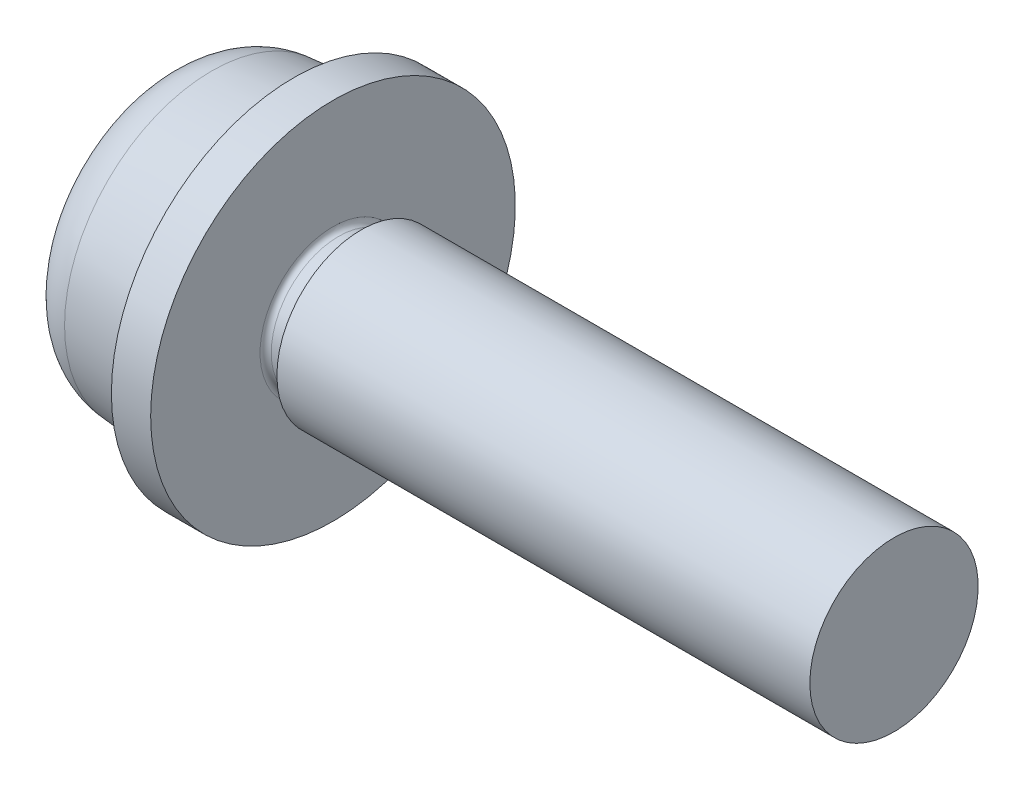
ISO-10303-21;
HEADER;
FILE_DESCRIPTION(('STEP AP214'),'2;1');
FILE_NAME('part.step','',(''),(''),'','','');
FILE_SCHEMA(('AUTOMOTIVE_DESIGN { 1 0 10303 214 1 1 1 1 }'));
ENDSEC;
DATA;
#1=APPLICATION_CONTEXT('core data for automotive mechanical design processes');
#2=APPLICATION_PROTOCOL_DEFINITION('international standard','automotive_design',2000,#1);
#3=PRODUCT_CONTEXT('',#1,'mechanical');
#4=PRODUCT('Part','Part','',(#3));
#5=PRODUCT_RELATED_PRODUCT_CATEGORY('part','',(#4));
#6=PRODUCT_DEFINITION_FORMATION('','',#4);
#7=PRODUCT_DEFINITION_CONTEXT('part definition',#1,'design');
#8=PRODUCT_DEFINITION('design','',#6,#7);
#9=PRODUCT_DEFINITION_SHAPE('','',#8);
#10=(LENGTH_UNIT() NAMED_UNIT(*) SI_UNIT(.MILLI.,.METRE.));
#11=(NAMED_UNIT(*) PLANE_ANGLE_UNIT() SI_UNIT($,.RADIAN.));
#12=(NAMED_UNIT(*) SI_UNIT($,.STERADIAN.) SOLID_ANGLE_UNIT());
#13=UNCERTAINTY_MEASURE_WITH_UNIT(LENGTH_MEASURE(1.E-05),#10,'distance_accuracy_value','');
#14=(GEOMETRIC_REPRESENTATION_CONTEXT(3) GLOBAL_UNCERTAINTY_ASSIGNED_CONTEXT((#13)) GLOBAL_UNIT_ASSIGNED_CONTEXT((#10,
#11,#12)) REPRESENTATION_CONTEXT('',''));
#15=CARTESIAN_POINT('',(0.,0.,0.));
#16=DIRECTION('',(0.,0.,1.));
#17=DIRECTION('',(1.,0.,0.));
#18=AXIS2_PLACEMENT_3D('',#15,#16,#17);
#19=CARTESIAN_POINT('',(3.7,0.,0.));
#20=DIRECTION('',(-1.,0.,0.));
#21=DIRECTION('',(0.,1.,0.));
#22=AXIS2_PLACEMENT_3D('',#19,#20,#21);
#23=SPHERICAL_SURFACE('',#22,7.);
#24=CARTESIAN_POINT('',(-3.03810877090718,0.,0.));
#25=DIRECTION('',(-1.,0.,0.));
#26=DIRECTION('',(0.,0.,1.));
#27=AXIS2_PLACEMENT_3D('',#24,#25,#26);
#28=CIRCLE('',#27,1.89681053124019);
#29=CARTESIAN_POINT('',(-3.03810877090718,0.,1.89681053124019));
#30=VERTEX_POINT('',#29);
#31=EDGE_CURVE('E168',#30,#30,#28,.T.);
#32=ORIENTED_EDGE('',*,*,#31,.T.);
#33=EDGE_LOOP('',(#32));
#34=FACE_BOUND('',#33,.T.);
#35=CARTESIAN_POINT('',(3.57699435965704,0.,0.697599651787471));
#36=DIRECTION('',(0.173648177666931,0.,-0.984807753012208));
#37=DIRECTION('',(-0.984807753012208,0.,-0.173648177666931));
#38=AXIS2_PLACEMENT_3D('',#35,#36,#37);
#39=CIRCLE('',#38,6.96406665234257);
#40=CARTESIAN_POINT('',(-3.234145616115,-0.815,-0.503388095323143));
#41=VERTEX_POINT('',#40);
#42=CARTESIAN_POINT('',(-3.04681075609609,-1.80535590507456,-0.470355905074564));
#43=VERTEX_POINT('',#42);
#44=EDGE_CURVE('E364',#41,#43,#39,.F.);
#45=ORIENTED_EDGE('',*,*,#44,.F.);
#46=CARTESIAN_POINT('',(-3.23412239886365,-0.503384065676875,-0.8152));
#47=CARTESIAN_POINT('',(-3.2361841022248,-0.503720168242263,-0.797461548615961));
#48=CARTESIAN_POINT('',(-3.23806436634861,-0.505570113570324,-0.779732879715822));
#49=CARTESIAN_POINT('',(-3.24141526293028,-0.512196978286428,-0.744798334867519));
#50=CARTESIAN_POINT('',(-3.24288605197477,-0.516972776561999,-0.727592261323287));
#51=CARTESIAN_POINT('',(-3.24537388751317,-0.529355987284934,-0.6941784559273));
#52=CARTESIAN_POINT('',(-3.24639057079739,-0.53696565747409,-0.677971532128639));
#53=CARTESIAN_POINT('',(-3.24793787600446,-0.554801698888622,-0.647049622974892));
#54=CARTESIAN_POINT('',(-3.24846867125351,-0.565027135349936,-0.63233410727113));
#55=CARTESIAN_POINT('',(-3.24902581590237,-0.587702640757301,-0.604945597382145));
#56=CARTESIAN_POINT('',(-3.24905669886425,-0.600131681817991,-0.592255281265016));
#57=CARTESIAN_POINT('',(-3.24862464492566,-0.626924582873753,-0.569117264378845));
#58=CARTESIAN_POINT('',(-3.24816159223481,-0.641288895853222,-0.558670090145964));
#59=CARTESIAN_POINT('',(-3.24675769458907,-0.671491843521828,-0.540340712533939));
#60=CARTESIAN_POINT('',(-3.24581816716934,-0.687326314857874,-0.532451533945633));
#61=CARTESIAN_POINT('',(-3.24348980303978,-0.720049078938647,-0.519412818499801));
#62=CARTESIAN_POINT('',(-3.24210126657802,-0.736936661404008,-0.514261456958241));
#63=CARTESIAN_POINT('',(-3.23957732974275,-0.764161701114374,-0.508360616233199));
#64=CARTESIAN_POINT('',(-3.23857498870375,-0.77431753965063,-0.506671700724917));
#65=CARTESIAN_POINT('',(-3.23644239822663,-0.794713288241198,-0.504285656604277));
#66=CARTESIAN_POINT('',(-3.23531237990671,-0.804953016227693,-0.503586765972321));
#67=CARTESIAN_POINT('',(-3.23412239886392,-0.815200000000031,-0.503384065676901));
#68=B_SPLINE_CURVE_WITH_KNOTS('',3,(#46,#47,#48,#49,#50,#51,#52,#53,#54,#55,#56,#57,#58,#59,#60,
#61,#62,#63,#64,#65,#66,#67),.UNSPECIFIED.,.F.,.F.,(4,2,2,2,2,2,2,2,2,2,4),(0.,0.05351835486266,
0.107016215667071,0.16055678964352,0.214078257150235,0.26711407899791,0.320162336448977,
0.373064699639575,0.425931760422739,0.456919638599966,0.48785229579544),.UNSPECIFIED.);
#69=CARTESIAN_POINT('',(-3.234145616115,-0.503388095323143,-0.815));
#70=VERTEX_POINT('',#69);
#71=EDGE_CURVE('E60',#70,#41,#68,.T.);
#72=ORIENTED_EDGE('',*,*,#71,.F.);
#73=CARTESIAN_POINT('',(3.57699435965704,0.697599651787472,0.));
#74=DIRECTION('',(0.173648177666931,-0.984807753012208,0.));
#75=DIRECTION('',(0.984807753012208,0.173648177666931,0.));
#76=AXIS2_PLACEMENT_3D('',#73,#74,#75);
#77=CIRCLE('',#76,6.96406665234257);
#78=CARTESIAN_POINT('',(-3.04681075609609,-0.470355905074564,-1.80535590507457));
#79=VERTEX_POINT('',#78);
#80=EDGE_CURVE('E365',#70,#79,#77,.T.);
#81=ORIENTED_EDGE('',*,*,#80,.T.);
#82=CARTESIAN_POINT('',(3.80529280532692,0.,-0.597145172587123));
#83=DIRECTION('',(0.173648177666931,0.,-0.984807753012208));
#84=DIRECTION('',(-0.984807753012208,0.,-0.173648177666931));
#85=AXIS2_PLACEMENT_3D('',#82,#83,#84);
#86=CIRCLE('',#85,6.97368848372239);
#87=CARTESIAN_POINT('',(-3.04681075609609,0.470355905074564,-1.80535590507457));
#88=VERTEX_POINT('',#87);
#89=EDGE_CURVE('E425',#88,#79,#86,.F.);
#90=ORIENTED_EDGE('',*,*,#89,.F.);
#91=CARTESIAN_POINT('',(3.57699435965704,-0.697599651787472,0.));
#92=DIRECTION('',(0.173648177666931,0.984807753012208,0.));
#93=DIRECTION('',(-0.984807753012208,0.173648177666931,0.));
#94=AXIS2_PLACEMENT_3D('',#91,#92,#93);
#95=CIRCLE('',#94,6.96406665234257);
#96=CARTESIAN_POINT('',(-3.234145616115,0.503388095323142,-0.815000000000001));
#97=VERTEX_POINT('',#96);
#98=EDGE_CURVE('E332',#88,#97,#95,.T.);
#99=ORIENTED_EDGE('',*,*,#98,.T.);
#100=CARTESIAN_POINT('',(-3.23412239886365,0.8152,-0.503384065676875));
#101=CARTESIAN_POINT('',(-3.2361841022248,0.79746154861596,-0.503720168242263));
#102=CARTESIAN_POINT('',(-3.23806436634861,0.779732879715821,-0.505570113570324));
#103=CARTESIAN_POINT('',(-3.24141526293028,0.744798334867518,-0.512196978286428));
#104=CARTESIAN_POINT('',(-3.24288605197477,0.727592261323287,-0.516972776561999));
#105=CARTESIAN_POINT('',(-3.24537388751317,0.694178455927299,-0.529355987284934));
#106=CARTESIAN_POINT('',(-3.24639057079739,0.677971532128638,-0.53696565747409));
#107=CARTESIAN_POINT('',(-3.24793787600446,0.647049622974892,-0.554801698888622));
#108=CARTESIAN_POINT('',(-3.24846867125351,0.63233410727113,-0.565027135349936));
#109=CARTESIAN_POINT('',(-3.24902581590237,0.604945597382144,-0.587702640757301));
#110=CARTESIAN_POINT('',(-3.24905669886425,0.592255281265016,-0.600131681817991));
#111=CARTESIAN_POINT('',(-3.24862464492566,0.569117264378845,-0.626924582873753));
#112=CARTESIAN_POINT('',(-3.24816159223481,0.558670090145964,-0.641288895853222));
#113=CARTESIAN_POINT('',(-3.24675769458907,0.540340712533938,-0.671491843521828));
#114=CARTESIAN_POINT('',(-3.24581816716934,0.532451533945633,-0.687326314857874));
#115=CARTESIAN_POINT('',(-3.24348980303978,0.5194128184998,-0.720049078938647));
#116=CARTESIAN_POINT('',(-3.24210126657802,0.514261456958241,-0.736936661404008));
#117=CARTESIAN_POINT('',(-3.23957732974275,0.508360616233198,-0.764161701114374));
#118=CARTESIAN_POINT('',(-3.23857498870375,0.506671700724916,-0.77431753965063));
#119=CARTESIAN_POINT('',(-3.23644239822663,0.504285656604276,-0.794713288241198));
#120=CARTESIAN_POINT('',(-3.23531237990671,0.50358676597232,-0.804953016227694));
#121=CARTESIAN_POINT('',(-3.23412239886392,0.5033840656769,-0.815200000000031));
#122=B_SPLINE_CURVE_WITH_KNOTS('',3,(#100,#101,#102,#103,#104,#105,#106,#107,#108,#109,#110,
#111,#112,#113,#114,#115,#116,#117,#118,#119,#120,#121),.UNSPECIFIED.,.F.,.F.,(4,2,2,2,2,2,2,2,
2,2,4),(0.,0.05351835486266,0.107016215667071,0.16055678964352,0.214078257150235,
0.26711407899791,0.320162336448977,0.373064699639574,0.425931760422739,0.456919638599966,
0.48785229579544),.UNSPECIFIED.);
#123=CARTESIAN_POINT('',(-3.234145616115,0.815,-0.503388095323143));
#124=VERTEX_POINT('',#123);
#125=EDGE_CURVE('E326',#124,#97,#122,.T.);
#126=ORIENTED_EDGE('',*,*,#125,.F.);
#127=CARTESIAN_POINT('',(3.57699435965704,0.,0.697599651787472));
#128=DIRECTION('',(0.173648177666931,0.,-0.984807753012208));
#129=DIRECTION('',(-0.984807753012208,0.,-0.173648177666931));
#130=AXIS2_PLACEMENT_3D('',#127,#128,#129);
#131=CIRCLE('',#130,6.96406665234257);
#132=CARTESIAN_POINT('',(-3.04681075609609,1.80535590507456,-0.470355905074564));
#133=VERTEX_POINT('',#132);
#134=EDGE_CURVE('E324',#133,#124,#131,.F.);
#135=ORIENTED_EDGE('',*,*,#134,.F.);
#136=CARTESIAN_POINT('',(3.80529280532692,0.597145172587122,0.));
#137=DIRECTION('',(0.173648177666931,0.984807753012208,0.));
#138=DIRECTION('',(-0.984807753012208,0.173648177666931,0.));
#139=AXIS2_PLACEMENT_3D('',#136,#137,#138);
#140=CIRCLE('',#139,6.97368848372239);
#141=CARTESIAN_POINT('',(-3.04681075609609,1.80535590507456,0.470355905074564));
#142=VERTEX_POINT('',#141);
#143=EDGE_CURVE('E321',#133,#142,#140,.T.);
#144=ORIENTED_EDGE('',*,*,#143,.T.);
#145=CARTESIAN_POINT('',(3.57699435965704,0.,-0.697599651787472));
#146=DIRECTION('',(0.173648177666931,0.,0.984807753012208));
#147=DIRECTION('',(0.984807753012208,0.,-0.173648177666931));
#148=AXIS2_PLACEMENT_3D('',#145,#146,#147);
#149=CIRCLE('',#148,6.96406665234257);
#150=CARTESIAN_POINT('',(-3.234145616115,0.815,0.503388095323143));
#151=VERTEX_POINT('',#150);
#152=EDGE_CURVE('E318',#151,#142,#149,.F.);
#153=ORIENTED_EDGE('',*,*,#152,.F.);
#154=CARTESIAN_POINT('',(-3.23412239886365,0.8152,0.503384065676875));
#155=CARTESIAN_POINT('',(-3.2361841022248,0.79746154861596,0.503720168242262));
#156=CARTESIAN_POINT('',(-3.23806436634861,0.779732879715821,0.505570113570324));
#157=CARTESIAN_POINT('',(-3.24141526293028,0.744798334867518,0.512196978286427));
#158=CARTESIAN_POINT('',(-3.24288605197477,0.727592261323286,0.516972776561999));
#159=CARTESIAN_POINT('',(-3.24537388751317,0.694178455927299,0.529355987284934));
#160=CARTESIAN_POINT('',(-3.24639057079739,0.677971532128638,0.53696565747409));
#161=CARTESIAN_POINT('',(-3.24793787600446,0.647049622974892,0.554801698888622));
#162=CARTESIAN_POINT('',(-3.24846867125351,0.632334107271129,0.565027135349936));
#163=CARTESIAN_POINT('',(-3.24902581590237,0.604945597382144,0.587702640757301));
#164=CARTESIAN_POINT('',(-3.24905669886425,0.592255281265016,0.60013168181799));
#165=CARTESIAN_POINT('',(-3.24862464492566,0.569117264378845,0.626924582873753));
#166=CARTESIAN_POINT('',(-3.24816159223481,0.558670090145964,0.641288895853222));
#167=CARTESIAN_POINT('',(-3.24675769458907,0.540340712533938,0.671491843521828));
#168=CARTESIAN_POINT('',(-3.24581816716934,0.532451533945633,0.687326314857874));
#169=CARTESIAN_POINT('',(-3.24348980303978,0.5194128184998,0.720049078938647));
#170=CARTESIAN_POINT('',(-3.24210126657802,0.514261456958241,0.736936661404008));
#171=CARTESIAN_POINT('',(-3.23957732974275,0.508360616233198,0.764161701114374));
#172=CARTESIAN_POINT('',(-3.23857498870375,0.506671700724916,0.77431753965063));
#173=CARTESIAN_POINT('',(-3.23644239822663,0.504285656604276,0.794713288241198));
#174=CARTESIAN_POINT('',(-3.23531237990671,0.50358676597232,0.804953016227693));
#175=CARTESIAN_POINT('',(-3.23412239886392,0.5033840656769,0.81520000000003));
#176=B_SPLINE_CURVE_WITH_KNOTS('',3,(#154,#155,#156,#157,#158,#159,#160,#161,#162,#163,#164,
#165,#166,#167,#168,#169,#170,#171,#172,#173,#174,#175),.UNSPECIFIED.,.F.,.F.,(4,2,2,2,2,2,2,2,
2,2,4),(0.,0.0535183548626601,0.107016215667071,0.16055678964352,0.214078257150235,
0.26711407899791,0.320162336448977,0.373064699639575,0.425931760422739,0.456919638599965,
0.48785229579544),.UNSPECIFIED.);
#177=CARTESIAN_POINT('',(-3.234145616115,0.503388095323142,0.815));
#178=VERTEX_POINT('',#177);
#179=EDGE_CURVE('E311',#151,#178,#176,.T.);
#180=ORIENTED_EDGE('',*,*,#179,.T.);
#181=CARTESIAN_POINT('',(3.57699435965704,-0.697599651787472,0.));
#182=DIRECTION('',(0.173648177666931,0.984807753012208,0.));
#183=DIRECTION('',(-0.984807753012208,0.173648177666931,0.));
#184=AXIS2_PLACEMENT_3D('',#181,#182,#183);
#185=CIRCLE('',#184,6.96406665234257);
#186=CARTESIAN_POINT('',(-3.04681075609609,0.470355905074564,1.80535590507456));
#187=VERTEX_POINT('',#186);
#188=EDGE_CURVE('E319',#178,#187,#185,.T.);
#189=ORIENTED_EDGE('',*,*,#188,.T.);
#190=CARTESIAN_POINT('',(3.80529280532692,0.,0.597145172587121));
#191=DIRECTION('',(0.173648177666931,0.,0.984807753012208));
#192=DIRECTION('',(0.984807753012208,0.,-0.173648177666931));
#193=AXIS2_PLACEMENT_3D('',#190,#191,#192);
#194=CIRCLE('',#193,6.97368848372239);
#195=CARTESIAN_POINT('',(-3.04681075609609,-0.470355905074564,1.80535590507456));
#196=VERTEX_POINT('',#195);
#197=EDGE_CURVE('E403',#196,#187,#194,.F.);
#198=ORIENTED_EDGE('',*,*,#197,.F.);
#199=CARTESIAN_POINT('',(3.57699435965704,0.697599651787471,0.));
#200=DIRECTION('',(0.173648177666931,-0.984807753012208,0.));
#201=DIRECTION('',(0.984807753012208,0.173648177666931,0.));
#202=AXIS2_PLACEMENT_3D('',#199,#200,#201);
#203=CIRCLE('',#202,6.96406665234257);
#204=CARTESIAN_POINT('',(-3.234145616115,-0.503388095323143,0.815));
#205=VERTEX_POINT('',#204);
#206=EDGE_CURVE('E279',#196,#205,#203,.T.);
#207=ORIENTED_EDGE('',*,*,#206,.T.);
#208=CARTESIAN_POINT('',(-3.23412239886365,-0.815200000000001,0.503384065676875));
#209=CARTESIAN_POINT('',(-3.2361841022248,-0.797461548615961,0.503720168242262));
#210=CARTESIAN_POINT('',(-3.23806436634861,-0.779732879715822,0.505570113570323));
#211=CARTESIAN_POINT('',(-3.24141526293028,-0.744798334867519,0.512196978286427));
#212=CARTESIAN_POINT('',(-3.24288605197477,-0.727592261323287,0.516972776561999));
#213=CARTESIAN_POINT('',(-3.24537388751317,-0.6941784559273,0.529355987284933));
#214=CARTESIAN_POINT('',(-3.24639057079739,-0.677971532128639,0.53696565747409));
#215=CARTESIAN_POINT('',(-3.24793787600446,-0.647049622974892,0.554801698888621));
#216=CARTESIAN_POINT('',(-3.24846867125351,-0.63233410727113,0.565027135349935));
#217=CARTESIAN_POINT('',(-3.24902581590237,-0.604945597382145,0.587702640757301));
#218=CARTESIAN_POINT('',(-3.24905669886425,-0.592255281265016,0.60013168181799));
#219=CARTESIAN_POINT('',(-3.24862464492566,-0.569117264378846,0.626924582873752));
#220=CARTESIAN_POINT('',(-3.24816159223481,-0.558670090145965,0.641288895853221));
#221=CARTESIAN_POINT('',(-3.24675769458907,-0.540340712533939,0.671491843521828));
#222=CARTESIAN_POINT('',(-3.24581816716934,-0.532451533945633,0.687326314857873));
#223=CARTESIAN_POINT('',(-3.24348980303978,-0.519412818499801,0.720049078938647));
#224=CARTESIAN_POINT('',(-3.24210126657802,-0.514261456958241,0.736936661404007));
#225=CARTESIAN_POINT('',(-3.23957732974275,-0.508360616233199,0.764161701114373));
#226=CARTESIAN_POINT('',(-3.23857498870375,-0.506671700724917,0.77431753965063));
#227=CARTESIAN_POINT('',(-3.23644239822663,-0.504285656604277,0.794713288241197));
#228=CARTESIAN_POINT('',(-3.23531237990671,-0.503586765972321,0.804953016227693));
#229=CARTESIAN_POINT('',(-3.23412239886392,-0.503384065676901,0.81520000000003));
#230=B_SPLINE_CURVE_WITH_KNOTS('',3,(#208,#209,#210,#211,#212,#213,#214,#215,#216,#217,#218,
#219,#220,#221,#222,#223,#224,#225,#226,#227,#228,#229),.UNSPECIFIED.,.F.,.F.,(4,2,2,2,2,2,2,2,
2,2,4),(0.,0.0535183548626601,0.107016215667071,0.16055678964352,0.214078257150235,
0.26711407899791,0.320162336448977,0.373064699639575,0.425931760422739,0.456919638599965,
0.48785229579544),.UNSPECIFIED.);
#231=CARTESIAN_POINT('',(-3.234145616115,-0.815000000000001,0.503388095323142));
#232=VERTEX_POINT('',#231);
#233=EDGE_CURVE('E273',#232,#205,#230,.T.);
#234=ORIENTED_EDGE('',*,*,#233,.F.);
#235=CARTESIAN_POINT('',(3.57699435965704,0.,-0.697599651787472));
#236=DIRECTION('',(0.173648177666931,0.,0.984807753012208));
#237=DIRECTION('',(0.984807753012208,0.,-0.173648177666931));
#238=AXIS2_PLACEMENT_3D('',#235,#236,#237);
#239=CIRCLE('',#238,6.96406665234257);
#240=CARTESIAN_POINT('',(-3.04681075609609,-1.80535590507456,0.470355905074564));
#241=VERTEX_POINT('',#240);
#242=EDGE_CURVE('E271',#241,#232,#239,.F.);
#243=ORIENTED_EDGE('',*,*,#242,.F.);
#244=CARTESIAN_POINT('',(3.80529280532692,-0.597145172587122,0.));
#245=DIRECTION('',(0.173648177666931,-0.984807753012208,0.));
#246=DIRECTION('',(0.984807753012208,0.173648177666931,0.));
#247=AXIS2_PLACEMENT_3D('',#244,#245,#246);
#248=CIRCLE('',#247,6.97368848372239);
#249=EDGE_CURVE('E268',#241,#43,#248,.T.);
#250=ORIENTED_EDGE('',*,*,#249,.T.);
#251=EDGE_LOOP('',(#45,#72,#81,#90,#99,#126,#135,#144,#153,#180,#189,#198,#207,#234,#243,#250));
#252=FACE_BOUND('',#251,.T.);
#253=ADVANCED_FACE('F37',(#34,#252),#23,.T.);
#254=CARTESIAN_POINT('',(10.,1.5,0.));
#255=DIRECTION('',(1.,0.,0.));
#256=DIRECTION('',(0.,0.,-1.));
#257=AXIS2_PLACEMENT_3D('',#254,#255,#256);
#258=PLANE('',#257);
#259=CARTESIAN_POINT('',(10.,0.,0.));
#260=DIRECTION('',(-1.,0.,0.));
#261=DIRECTION('',(0.,0.,1.));
#262=AXIS2_PLACEMENT_3D('',#259,#260,#261);
#263=CIRCLE('',#262,1.5);
#264=CARTESIAN_POINT('',(10.,0.,1.5));
#265=VERTEX_POINT('',#264);
#266=EDGE_CURVE('E265',#265,#265,#263,.T.);
#267=ORIENTED_EDGE('',*,*,#266,.F.);
#268=EDGE_LOOP('',(#267));
#269=FACE_BOUND('',#268,.T.);
#270=ADVANCED_FACE('F381',(#269),#258,.T.);
#271=CARTESIAN_POINT('',(0.,0.,0.));
#272=DIRECTION('',(-1.,0.,0.));
#273=DIRECTION('',(0.,0.,1.));
#274=AXIS2_PLACEMENT_3D('',#271,#272,#273);
#275=CYLINDRICAL_SURFACE('',#274,1.5);
#276=ORIENTED_EDGE('',*,*,#266,.T.);
#277=EDGE_LOOP('',(#276));
#278=FACE_BOUND('',#277,.T.);
#279=CARTESIAN_POINT('',(0.5,0.,0.));
#280=DIRECTION('',(-1.,0.,0.));
#281=DIRECTION('',(0.,0.,1.));
#282=AXIS2_PLACEMENT_3D('',#279,#280,#281);
#283=CIRCLE('',#282,1.5);
#284=CARTESIAN_POINT('',(0.5,0.,1.5));
#285=VERTEX_POINT('',#284);
#286=EDGE_CURVE('E262',#285,#285,#283,.T.);
#287=ORIENTED_EDGE('',*,*,#286,.F.);
#288=EDGE_LOOP('',(#287));
#289=FACE_BOUND('',#288,.T.);
#290=ADVANCED_FACE('F386',(#278,#289),#275,.T.);
#291=CARTESIAN_POINT('',(0.5,1.2,0.));
#292=DIRECTION('',(-1.,0.,0.));
#293=DIRECTION('',(0.,0.,1.));
#294=AXIS2_PLACEMENT_3D('',#291,#292,#293);
#295=PLANE('',#294);
#296=ORIENTED_EDGE('',*,*,#286,.T.);
#297=EDGE_LOOP('',(#296));
#298=FACE_BOUND('',#297,.T.);
#299=CARTESIAN_POINT('',(0.5,0.,0.));
#300=DIRECTION('',(-1.,0.,0.));
#301=DIRECTION('',(0.,0.,1.));
#302=AXIS2_PLACEMENT_3D('',#299,#300,#301);
#303=CIRCLE('',#302,1.2);
#304=CARTESIAN_POINT('',(0.5,0.,1.2));
#305=VERTEX_POINT('',#304);
#306=EDGE_CURVE('E259',#305,#305,#303,.T.);
#307=ORIENTED_EDGE('',*,*,#306,.F.);
#308=EDGE_LOOP('',(#307));
#309=FACE_BOUND('',#308,.T.);
#310=ADVANCED_FACE('F504',(#298,#309),#295,.T.);
#311=CARTESIAN_POINT('',(0.,0.,0.));
#312=DIRECTION('',(-1.,0.,0.));
#313=DIRECTION('',(0.,0.,1.));
#314=AXIS2_PLACEMENT_3D('',#311,#312,#313);
#315=CYLINDRICAL_SURFACE('',#314,1.2);
#316=CARTESIAN_POINT('',(0.1,0.,0.));
#317=DIRECTION('',(1.,0.,0.));
#318=DIRECTION('',(0.,0.,-1.));
#319=AXIS2_PLACEMENT_3D('',#316,#317,#318);
#320=CIRCLE('',#319,1.2);
#321=CARTESIAN_POINT('',(0.1,0.,-1.2));
#322=VERTEX_POINT('',#321);
#323=EDGE_CURVE('E12',#322,#322,#320,.T.);
#324=ORIENTED_EDGE('',*,*,#323,.T.);
#325=EDGE_LOOP('',(#324));
#326=FACE_BOUND('',#325,.T.);
#327=ORIENTED_EDGE('',*,*,#306,.T.);
#328=EDGE_LOOP('',(#327));
#329=FACE_BOUND('',#328,.T.);
#330=ADVANCED_FACE('F497',(#326,#329),#315,.T.);
#331=CARTESIAN_POINT('',(0.,3.25,0.));
#332=DIRECTION('',(1.,0.,0.));
#333=DIRECTION('',(0.,0.,-1.));
#334=AXIS2_PLACEMENT_3D('',#331,#332,#333);
#335=PLANE('',#334);
#336=CARTESIAN_POINT('',(0.,0.,0.));
#337=DIRECTION('',(1.,0.,0.));
#338=DIRECTION('',(0.,0.,-1.));
#339=AXIS2_PLACEMENT_3D('',#336,#337,#338);
#340=CIRCLE('',#339,1.3);
#341=CARTESIAN_POINT('',(0.,0.,-1.3));
#342=VERTEX_POINT('',#341);
#343=EDGE_CURVE('E45',#342,#342,#340,.F.);
#344=ORIENTED_EDGE('',*,*,#343,.T.);
#345=EDGE_LOOP('',(#344));
#346=FACE_BOUND('',#345,.T.);
#347=CARTESIAN_POINT('',(0.,0.,0.));
#348=DIRECTION('',(-1.,0.,0.));
#349=DIRECTION('',(0.,0.,1.));
#350=AXIS2_PLACEMENT_3D('',#347,#348,#349);
#351=CIRCLE('',#350,3.25);
#352=CARTESIAN_POINT('',(0.,0.,3.25));
#353=VERTEX_POINT('',#352);
#354=EDGE_CURVE('E256',#353,#353,#351,.T.);
#355=ORIENTED_EDGE('',*,*,#354,.F.);
#356=EDGE_LOOP('',(#355));
#357=FACE_BOUND('',#356,.T.);
#358=ADVANCED_FACE('F369',(#346,#357),#335,.T.);
#359=CARTESIAN_POINT('',(0.,0.,0.));
#360=DIRECTION('',(-1.,0.,0.));
#361=DIRECTION('',(0.,0.,1.));
#362=AXIS2_PLACEMENT_3D('',#359,#360,#361);
#363=CYLINDRICAL_SURFACE('',#362,3.25);
#364=CARTESIAN_POINT('',(-0.7,0.,0.));
#365=DIRECTION('',(-1.,0.,0.));
#366=DIRECTION('',(0.,0.,1.));
#367=AXIS2_PLACEMENT_3D('',#364,#365,#366);
#368=CIRCLE('',#367,3.25);
#369=CARTESIAN_POINT('',(-0.7,0.,3.25));
#370=VERTEX_POINT('',#369);
#371=EDGE_CURVE('E253',#370,#370,#368,.T.);
#372=ORIENTED_EDGE('',*,*,#371,.F.);
#373=EDGE_LOOP('',(#372));
#374=FACE_BOUND('',#373,.T.);
#375=ORIENTED_EDGE('',*,*,#354,.T.);
#376=EDGE_LOOP('',(#375));
#377=FACE_BOUND('',#376,.T.);
#378=ADVANCED_FACE('F481',(#374,#377),#363,.T.);
#379=CARTESIAN_POINT('',(-0.7,3.25,0.));
#380=DIRECTION('',(1.,0.,0.));
#381=DIRECTION('',(0.,0.,-1.));
#382=AXIS2_PLACEMENT_3D('',#379,#380,#381);
#383=PLANE('',#382);
#384=CARTESIAN_POINT('',(-0.7,0.,0.));
#385=DIRECTION('',(-1.,0.,0.));
#386=DIRECTION('',(0.,0.,1.));
#387=AXIS2_PLACEMENT_3D('',#384,#385,#386);
#388=CIRCLE('',#387,2.75);
#389=CARTESIAN_POINT('',(-0.7,0.,2.75));
#390=VERTEX_POINT('',#389);
#391=EDGE_CURVE('E250',#390,#390,#388,.T.);
#392=ORIENTED_EDGE('',*,*,#391,.F.);
#393=EDGE_LOOP('',(#392));
#394=FACE_BOUND('',#393,.T.);
#395=ORIENTED_EDGE('',*,*,#371,.T.);
#396=EDGE_LOOP('',(#395));
#397=FACE_BOUND('',#396,.T.);
#398=ADVANCED_FACE('F474',(#394,#397),#383,.F.);
#399=CARTESIAN_POINT('',(-2.16267754638239,0.,0.));
#400=DIRECTION('',(1.,0.,0.));
#401=DIRECTION('',(0.,0.,-1.));
#402=AXIS2_PLACEMENT_3D('',#399,#400,#401);
#403=CONICAL_SURFACE('',#402,2.62203229629762,0.0872664625997199);
#404=ORIENTED_EDGE('',*,*,#391,.T.);
#405=EDGE_LOOP('',(#404));
#406=FACE_BOUND('',#405,.T.);
#407=CARTESIAN_POINT('',(-2.16267754638239,0.,0.));
#408=DIRECTION('',(-1.,0.,0.));
#409=DIRECTION('',(0.,0.,1.));
#410=AXIS2_PLACEMENT_3D('',#407,#408,#409);
#411=CIRCLE('',#410,2.62203229629762);
#412=CARTESIAN_POINT('',(-2.16267754638239,0.,2.62203229629762));
#413=VERTEX_POINT('',#412);
#414=EDGE_CURVE('E172',#413,#413,#411,.T.);
#415=ORIENTED_EDGE('',*,*,#414,.F.);
#416=EDGE_LOOP('',(#415));
#417=FACE_BOUND('',#416,.T.);
#418=ADVANCED_FACE('F467',(#406,#417),#403,.T.);
#419=CARTESIAN_POINT('',(-2.07552180363473,0.,0.));
#420=DIRECTION('',(-1.,0.,0.));
#421=DIRECTION('',(0.,0.,1.));
#422=AXIS2_PLACEMENT_3D('',#419,#420,#421);
#423=TOROIDAL_SURFACE('',#422,1.62583759820588,0.999999999999999);
#424=ORIENTED_EDGE('',*,*,#414,.T.);
#425=EDGE_LOOP('',(#424));
#426=FACE_BOUND('',#425,.T.);
#427=ORIENTED_EDGE('',*,*,#31,.F.);
#428=EDGE_LOOP('',(#427));
#429=FACE_BOUND('',#428,.T.);
#430=ADVANCED_FACE('F356',(#426,#429),#423,.T.);
#431=CARTESIAN_POINT('',(-3.3,-1.85,-0.515));
#432=DIRECTION('',(0.173648177666931,0.,-0.984807753012208));
#433=DIRECTION('',(-0.984807753012208,0.,-0.173648177666931));
#434=AXIS2_PLACEMENT_3D('',#431,#432,#433);
#435=PLANE('',#434);
#436=ORIENTED_EDGE('',*,*,#44,.T.);
#437=DIRECTION('',(0.970287525247814,0.171087869746036,0.171087869746036));
#438=VECTOR('',#437,1.);
#439=CARTESIAN_POINT('',(-3.3,-1.85,-0.515));
#440=LINE('',#439,#438);
#441=CARTESIAN_POINT('',(-1.77,-1.58021971951605,-0.245219719516048));
#442=VERTEX_POINT('',#441);
#443=EDGE_CURVE('E52',#442,#43,#440,.F.);
#444=ORIENTED_EDGE('',*,*,#443,.F.);
#445=DIRECTION('',(0.,-1.,0.));
#446=VECTOR('',#445,1.);
#447=CARTESIAN_POINT('',(-1.77,-0.815,-0.245219719516048));
#448=LINE('',#447,#446);
#449=CARTESIAN_POINT('',(-1.77,-0.815000000000001,-0.245219719516048));
#450=VERTEX_POINT('',#449);
#451=EDGE_CURVE('E156',#442,#450,#448,.F.);
#452=ORIENTED_EDGE('',*,*,#451,.T.);
#453=DIRECTION('',(-0.984807753012208,0.,-0.173648177666931));
#454=VECTOR('',#453,1.);
#455=CARTESIAN_POINT('',(-3.3,-0.815,-0.515));
#456=LINE('',#455,#454);
#457=EDGE_CURVE('E164',#450,#41,#456,.T.);
#458=ORIENTED_EDGE('',*,*,#457,.T.);
#459=EDGE_LOOP('',(#436,#444,#452,#458));
#460=FACE_BOUND('',#459,.T.);
#461=ADVANCED_FACE('F163',(#460),#435,.F.);
#462=CARTESIAN_POINT('',(-3.3,-0.815,-0.815));
#463=DIRECTION('',(1.,0.,0.));
#464=DIRECTION('',(0.,0.,1.));
#465=AXIS2_PLACEMENT_3D('',#462,#463,#464);
#466=CONICAL_SURFACE('',#465,0.3,0.174532925199433);
#467=ORIENTED_EDGE('',*,*,#71,.T.);
#468=ORIENTED_EDGE('',*,*,#457,.F.);
#469=CARTESIAN_POINT('',(-1.77,-0.815,-0.815));
#470=DIRECTION('',(-1.,0.,0.));
#471=DIRECTION('',(0.,0.,1.));
#472=AXIS2_PLACEMENT_3D('',#469,#470,#471);
#473=CIRCLE('',#472,0.569780280483952);
#474=CARTESIAN_POINT('',(-1.77,-0.245219719516048,-0.815));
#475=VERTEX_POINT('',#474);
#476=EDGE_CURVE('E152',#450,#475,#473,.T.);
#477=ORIENTED_EDGE('',*,*,#476,.T.);
#478=DIRECTION('',(-0.984807753012208,-0.173648177666931,0.));
#479=VECTOR('',#478,1.);
#480=CARTESIAN_POINT('',(-3.3,-0.515,-0.815));
#481=LINE('',#480,#479);
#482=EDGE_CURVE('E169',#475,#70,#481,.T.);
#483=ORIENTED_EDGE('',*,*,#482,.T.);
#484=EDGE_LOOP('',(#467,#468,#477,#483));
#485=FACE_BOUND('',#484,.T.);
#486=ADVANCED_FACE('F167',(#485),#466,.T.);
#487=CARTESIAN_POINT('',(-3.3,-0.515,-1.85));
#488=DIRECTION('',(0.173648177666931,-0.984807753012208,0.));
#489=DIRECTION('',(0.984807753012208,0.173648177666931,0.));
#490=AXIS2_PLACEMENT_3D('',#487,#488,#489);
#491=PLANE('',#490);
#492=ORIENTED_EDGE('',*,*,#482,.F.);
#493=DIRECTION('',(0.,0.,1.));
#494=VECTOR('',#493,1.);
#495=CARTESIAN_POINT('',(-1.77,-0.245219719516048,-0.815));
#496=LINE('',#495,#494);
#497=CARTESIAN_POINT('',(-1.77,-0.245219719516048,-1.58021971951605));
#498=VERTEX_POINT('',#497);
#499=EDGE_CURVE('E159',#498,#475,#496,.T.);
#500=ORIENTED_EDGE('',*,*,#499,.F.);
#501=DIRECTION('',(0.970287525247814,0.171087869746036,0.171087869746036));
#502=VECTOR('',#501,1.);
#503=CARTESIAN_POINT('',(-3.3,-0.515,-1.85));
#504=LINE('',#503,#502);
#505=EDGE_CURVE('E174',#498,#79,#504,.F.);
#506=ORIENTED_EDGE('',*,*,#505,.T.);
#507=ORIENTED_EDGE('',*,*,#80,.F.);
#508=EDGE_LOOP('',(#492,#500,#506,#507));
#509=FACE_BOUND('',#508,.T.);
#510=ADVANCED_FACE('F348',(#509),#491,.F.);
#511=CARTESIAN_POINT('',(-3.3,-0.515,-1.85));
#512=DIRECTION('',(0.173648177666931,0.,-0.984807753012208));
#513=DIRECTION('',(-0.984807753012208,0.,-0.173648177666931));
#514=AXIS2_PLACEMENT_3D('',#511,#512,#513);
#515=PLANE('',#514);
#516=ORIENTED_EDGE('',*,*,#89,.T.);
#517=ORIENTED_EDGE('',*,*,#505,.F.);
#518=DIRECTION('',(0.,-1.,0.));
#519=VECTOR('',#518,1.);
#520=CARTESIAN_POINT('',(-1.77,-0.815,-1.58021971951605));
#521=LINE('',#520,#519);
#522=CARTESIAN_POINT('',(-1.77,0.245219719516048,-1.58021971951605));
#523=VERTEX_POINT('',#522);
#524=EDGE_CURVE('E218',#498,#523,#521,.F.);
#525=ORIENTED_EDGE('',*,*,#524,.T.);
#526=DIRECTION('',(0.970287525247814,-0.171087869746036,0.171087869746036));
#527=VECTOR('',#526,1.);
#528=CARTESIAN_POINT('',(-3.12901544149212,0.484850809050536,-1.81985080905054));
#529=LINE('',#528,#527);
#530=EDGE_CURVE('E212',#523,#88,#529,.F.);
#531=ORIENTED_EDGE('',*,*,#530,.T.);
#532=EDGE_LOOP('',(#516,#517,#525,#531));
#533=FACE_BOUND('',#532,.T.);
#534=ADVANCED_FACE('F344',(#533),#515,.F.);
#535=CARTESIAN_POINT('',(-3.3,0.515,-0.815));
#536=DIRECTION('',(0.173648177666931,0.984807753012208,0.));
#537=DIRECTION('',(-0.984807753012208,0.173648177666931,0.));
#538=AXIS2_PLACEMENT_3D('',#535,#536,#537);
#539=PLANE('',#538);
#540=ORIENTED_EDGE('',*,*,#530,.F.);
#541=DIRECTION('',(0.,0.,-1.));
#542=VECTOR('',#541,1.);
#543=CARTESIAN_POINT('',(-1.77,0.245219719516048,-0.815000000000001));
#544=LINE('',#543,#542);
#545=CARTESIAN_POINT('',(-1.77,0.245219719516048,-0.815000000000001));
#546=VERTEX_POINT('',#545);
#547=EDGE_CURVE('E220',#546,#523,#544,.T.);
#548=ORIENTED_EDGE('',*,*,#547,.F.);
#549=DIRECTION('',(-0.984807753012208,0.173648177666931,0.));
#550=VECTOR('',#549,1.);
#551=CARTESIAN_POINT('',(-3.3,0.515,-0.815000000000001));
#552=LINE('',#551,#550);
#553=EDGE_CURVE('E209',#546,#97,#552,.T.);
#554=ORIENTED_EDGE('',*,*,#553,.T.);
#555=ORIENTED_EDGE('',*,*,#98,.F.);
#556=EDGE_LOOP('',(#540,#548,#554,#555));
#557=FACE_BOUND('',#556,.T.);
#558=ADVANCED_FACE('F340',(#557),#539,.F.);
#559=CARTESIAN_POINT('',(-3.3,0.815,-0.815));
#560=DIRECTION('',(1.,0.,0.));
#561=DIRECTION('',(0.,0.,1.));
#562=AXIS2_PLACEMENT_3D('',#559,#560,#561);
#563=CONICAL_SURFACE('',#562,0.3,0.174532925199433);
#564=ORIENTED_EDGE('',*,*,#125,.T.);
#565=ORIENTED_EDGE('',*,*,#553,.F.);
#566=CARTESIAN_POINT('',(-1.77,0.815,-0.815));
#567=DIRECTION('',(-1.,0.,0.));
#568=DIRECTION('',(0.,0.,1.));
#569=AXIS2_PLACEMENT_3D('',#566,#567,#568);
#570=CIRCLE('',#569,0.569780280483952);
#571=CARTESIAN_POINT('',(-1.77,0.815,-0.245219719516048));
#572=VERTEX_POINT('',#571);
#573=EDGE_CURVE('E223',#546,#572,#570,.T.);
#574=ORIENTED_EDGE('',*,*,#573,.T.);
#575=DIRECTION('',(-0.984807753012208,0.,-0.173648177666931));
#576=VECTOR('',#575,1.);
#577=CARTESIAN_POINT('',(-3.3,0.815,-0.515));
#578=LINE('',#577,#576);
#579=EDGE_CURVE('E206',#572,#124,#578,.T.);
#580=ORIENTED_EDGE('',*,*,#579,.T.);
#581=EDGE_LOOP('',(#564,#565,#574,#580));
#582=FACE_BOUND('',#581,.T.);
#583=ADVANCED_FACE('F334',(#582),#563,.T.);
#584=CARTESIAN_POINT('',(-3.3,0.815,-0.515));
#585=DIRECTION('',(0.173648177666931,0.,-0.984807753012208));
#586=DIRECTION('',(-0.984807753012208,0.,-0.173648177666931));
#587=AXIS2_PLACEMENT_3D('',#584,#585,#586);
#588=PLANE('',#587);
#589=ORIENTED_EDGE('',*,*,#134,.T.);
#590=ORIENTED_EDGE('',*,*,#579,.F.);
#591=DIRECTION('',(0.,-1.,0.));
#592=VECTOR('',#591,1.);
#593=CARTESIAN_POINT('',(-1.77,-0.815,-0.245219719516049));
#594=LINE('',#593,#592);
#595=CARTESIAN_POINT('',(-1.77,1.58021971951605,-0.245219719516048));
#596=VERTEX_POINT('',#595);
#597=EDGE_CURVE('E225',#572,#596,#594,.F.);
#598=ORIENTED_EDGE('',*,*,#597,.T.);
#599=DIRECTION('',(0.970287525247814,-0.171087869746036,0.171087869746036));
#600=VECTOR('',#599,1.);
#601=CARTESIAN_POINT('',(-3.12818541936345,1.81970445375467,-0.484704453754665));
#602=LINE('',#601,#600);
#603=EDGE_CURVE('E203',#596,#133,#602,.F.);
#604=ORIENTED_EDGE('',*,*,#603,.T.);
#605=EDGE_LOOP('',(#589,#590,#598,#604));
#606=FACE_BOUND('',#605,.T.);
#607=ADVANCED_FACE('F339',(#606),#588,.F.);
#608=CARTESIAN_POINT('',(-3.3,1.85,0.515));
#609=DIRECTION('',(0.173648177666931,0.984807753012208,0.));
#610=DIRECTION('',(-0.984807753012208,0.173648177666931,0.));
#611=AXIS2_PLACEMENT_3D('',#608,#609,#610);
#612=PLANE('',#611);
#613=ORIENTED_EDGE('',*,*,#603,.F.);
#614=DIRECTION('',(0.,0.,-1.));
#615=VECTOR('',#614,1.);
#616=CARTESIAN_POINT('',(-1.77,1.58021971951605,-0.815000000000001));
#617=LINE('',#616,#615);
#618=CARTESIAN_POINT('',(-1.77,1.58021971951605,0.245219719516048));
#619=VERTEX_POINT('',#618);
#620=EDGE_CURVE('E227',#619,#596,#617,.T.);
#621=ORIENTED_EDGE('',*,*,#620,.F.);
#622=DIRECTION('',(0.970287525247814,-0.171087869746036,-0.171087869746036));
#623=VECTOR('',#622,1.);
#624=CARTESIAN_POINT('',(-3.3,1.85,0.515));
#625=LINE('',#624,#623);
#626=EDGE_CURVE('E200',#619,#142,#625,.F.);
#627=ORIENTED_EDGE('',*,*,#626,.T.);
#628=ORIENTED_EDGE('',*,*,#143,.F.);
#629=EDGE_LOOP('',(#613,#621,#627,#628));
#630=FACE_BOUND('',#629,.T.);
#631=ADVANCED_FACE('F415',(#630),#612,.F.);
#632=CARTESIAN_POINT('',(-3.3,1.85,0.515));
#633=DIRECTION('',(0.173648177666931,0.,0.984807753012208));
#634=DIRECTION('',(0.984807753012208,0.,-0.173648177666931));
#635=AXIS2_PLACEMENT_3D('',#632,#633,#634);
#636=PLANE('',#635);
#637=ORIENTED_EDGE('',*,*,#152,.T.);
#638=ORIENTED_EDGE('',*,*,#626,.F.);
#639=DIRECTION('',(0.,1.,0.));
#640=VECTOR('',#639,1.);
#641=CARTESIAN_POINT('',(-1.77,-0.815,0.245219719516048));
#642=LINE('',#641,#640);
#643=CARTESIAN_POINT('',(-1.77,0.815,0.245219719516048));
#644=VERTEX_POINT('',#643);
#645=EDGE_CURVE('E230',#619,#644,#642,.F.);
#646=ORIENTED_EDGE('',*,*,#645,.T.);
#647=DIRECTION('',(-0.984807753012208,0.,0.173648177666931));
#648=VECTOR('',#647,1.);
#649=CARTESIAN_POINT('',(-3.3,0.815,0.515));
#650=LINE('',#649,#648);
#651=EDGE_CURVE('E197',#644,#151,#650,.T.);
#652=ORIENTED_EDGE('',*,*,#651,.T.);
#653=EDGE_LOOP('',(#637,#638,#646,#652));
#654=FACE_BOUND('',#653,.T.);
#655=ADVANCED_FACE('F307',(#654),#636,.F.);
#656=CARTESIAN_POINT('',(-3.3,0.815,0.815));
#657=DIRECTION('',(1.,0.,0.));
#658=DIRECTION('',(0.,0.,-1.));
#659=AXIS2_PLACEMENT_3D('',#656,#657,#658);
#660=CONICAL_SURFACE('',#659,0.3,0.174532925199433);
#661=ORIENTED_EDGE('',*,*,#651,.F.);
#662=CARTESIAN_POINT('',(-1.77,0.815,0.815));
#663=DIRECTION('',(-1.,0.,0.));
#664=DIRECTION('',(0.,0.,1.));
#665=AXIS2_PLACEMENT_3D('',#662,#663,#664);
#666=CIRCLE('',#665,0.569780280483952);
#667=CARTESIAN_POINT('',(-1.77,0.245219719516048,0.815));
#668=VERTEX_POINT('',#667);
#669=EDGE_CURVE('E232',#668,#644,#666,.F.);
#670=ORIENTED_EDGE('',*,*,#669,.F.);
#671=DIRECTION('',(-0.984807753012208,0.173648177666931,0.));
#672=VECTOR('',#671,1.);
#673=CARTESIAN_POINT('',(-3.3,0.515,0.815));
#674=LINE('',#673,#672);
#675=EDGE_CURVE('E194',#668,#178,#674,.T.);
#676=ORIENTED_EDGE('',*,*,#675,.T.);
#677=ORIENTED_EDGE('',*,*,#179,.F.);
#678=EDGE_LOOP('',(#661,#670,#676,#677));
#679=FACE_BOUND('',#678,.T.);
#680=ADVANCED_FACE('F302',(#679),#660,.T.);
#681=CARTESIAN_POINT('',(-3.3,0.515,1.85));
#682=DIRECTION('',(0.173648177666931,0.984807753012208,0.));
#683=DIRECTION('',(-0.984807753012208,0.173648177666931,0.));
#684=AXIS2_PLACEMENT_3D('',#681,#682,#683);
#685=PLANE('',#684);
#686=ORIENTED_EDGE('',*,*,#675,.F.);
#687=DIRECTION('',(0.,0.,-1.));
#688=VECTOR('',#687,1.);
#689=CARTESIAN_POINT('',(-1.77,0.245219719516047,-0.815000000000001));
#690=LINE('',#689,#688);
#691=CARTESIAN_POINT('',(-1.77,0.245219719516048,1.58021971951605));
#692=VERTEX_POINT('',#691);
#693=EDGE_CURVE('E235',#692,#668,#690,.T.);
#694=ORIENTED_EDGE('',*,*,#693,.F.);
#695=DIRECTION('',(0.970287525247814,-0.171087869746036,-0.171087869746036));
#696=VECTOR('',#695,1.);
#697=CARTESIAN_POINT('',(-3.3,0.515,1.85));
#698=LINE('',#697,#696);
#699=EDGE_CURVE('E191',#692,#187,#698,.F.);
#700=ORIENTED_EDGE('',*,*,#699,.T.);
#701=ORIENTED_EDGE('',*,*,#188,.F.);
#702=EDGE_LOOP('',(#686,#694,#700,#701));
#703=FACE_BOUND('',#702,.T.);
#704=ADVANCED_FACE('F298',(#703),#685,.F.);
#705=CARTESIAN_POINT('',(-3.3,0.515,1.85));
#706=DIRECTION('',(0.173648177666931,0.,0.984807753012208));
#707=DIRECTION('',(0.984807753012208,0.,-0.173648177666931));
#708=AXIS2_PLACEMENT_3D('',#705,#706,#707);
#709=PLANE('',#708);
#710=ORIENTED_EDGE('',*,*,#197,.T.);
#711=ORIENTED_EDGE('',*,*,#699,.F.);
#712=DIRECTION('',(0.,1.,0.));
#713=VECTOR('',#712,1.);
#714=CARTESIAN_POINT('',(-1.77,-0.815000000000001,1.58021971951605));
#715=LINE('',#714,#713);
#716=CARTESIAN_POINT('',(-1.77,-0.245219719516048,1.58021971951605));
#717=VERTEX_POINT('',#716);
#718=EDGE_CURVE('E238',#692,#717,#715,.F.);
#719=ORIENTED_EDGE('',*,*,#718,.T.);
#720=DIRECTION('',(0.970287525247814,0.171087869746036,-0.171087869746036));
#721=VECTOR('',#720,1.);
#722=CARTESIAN_POINT('',(-3.12901544149212,-0.484850809050536,1.81985080905053));
#723=LINE('',#722,#721);
#724=EDGE_CURVE('E188',#717,#196,#723,.F.);
#725=ORIENTED_EDGE('',*,*,#724,.T.);
#726=EDGE_LOOP('',(#710,#711,#719,#725));
#727=FACE_BOUND('',#726,.T.);
#728=ADVANCED_FACE('F294',(#727),#709,.F.);
#729=CARTESIAN_POINT('',(-3.3,-0.515,0.815));
#730=DIRECTION('',(0.173648177666931,-0.984807753012208,0.));
#731=DIRECTION('',(0.984807753012208,0.173648177666931,0.));
#732=AXIS2_PLACEMENT_3D('',#729,#730,#731);
#733=PLANE('',#732);
#734=ORIENTED_EDGE('',*,*,#724,.F.);
#735=DIRECTION('',(0.,0.,1.));
#736=VECTOR('',#735,1.);
#737=CARTESIAN_POINT('',(-1.77,-0.245219719516049,-0.815000000000001));
#738=LINE('',#737,#736);
#739=CARTESIAN_POINT('',(-1.77,-0.245219719516048,0.815));
#740=VERTEX_POINT('',#739);
#741=EDGE_CURVE('E240',#740,#717,#738,.T.);
#742=ORIENTED_EDGE('',*,*,#741,.F.);
#743=DIRECTION('',(-0.984807753012208,-0.173648177666931,0.));
#744=VECTOR('',#743,1.);
#745=CARTESIAN_POINT('',(-3.3,-0.515,0.815));
#746=LINE('',#745,#744);
#747=EDGE_CURVE('E185',#740,#205,#746,.T.);
#748=ORIENTED_EDGE('',*,*,#747,.T.);
#749=ORIENTED_EDGE('',*,*,#206,.F.);
#750=EDGE_LOOP('',(#734,#742,#748,#749));
#751=FACE_BOUND('',#750,.T.);
#752=ADVANCED_FACE('F289',(#751),#733,.F.);
#753=CARTESIAN_POINT('',(-3.3,-0.815,0.815));
#754=DIRECTION('',(1.,0.,0.));
#755=DIRECTION('',(0.,0.,1.));
#756=AXIS2_PLACEMENT_3D('',#753,#754,#755);
#757=CONICAL_SURFACE('',#756,0.3,0.174532925199433);
#758=ORIENTED_EDGE('',*,*,#233,.T.);
#759=ORIENTED_EDGE('',*,*,#747,.F.);
#760=CARTESIAN_POINT('',(-1.77,-0.815,0.815));
#761=DIRECTION('',(-1.,0.,0.));
#762=DIRECTION('',(0.,0.,1.));
#763=AXIS2_PLACEMENT_3D('',#760,#761,#762);
#764=CIRCLE('',#763,0.569780280483952);
#765=CARTESIAN_POINT('',(-1.77,-0.815000000000001,0.245219719516048));
#766=VERTEX_POINT('',#765);
#767=EDGE_CURVE('E243',#740,#766,#764,.T.);
#768=ORIENTED_EDGE('',*,*,#767,.T.);
#769=DIRECTION('',(-0.984807753012208,0.,0.173648177666931));
#770=VECTOR('',#769,1.);
#771=CARTESIAN_POINT('',(-3.3,-0.815000000000001,0.515));
#772=LINE('',#771,#770);
#773=EDGE_CURVE('E182',#766,#232,#772,.T.);
#774=ORIENTED_EDGE('',*,*,#773,.T.);
#775=EDGE_LOOP('',(#758,#759,#768,#774));
#776=FACE_BOUND('',#775,.T.);
#777=ADVANCED_FACE('F283',(#776),#757,.T.);
#778=CARTESIAN_POINT('',(-3.3,-0.815000000000001,0.515));
#779=DIRECTION('',(0.173648177666931,0.,0.984807753012208));
#780=DIRECTION('',(0.984807753012208,0.,-0.173648177666931));
#781=AXIS2_PLACEMENT_3D('',#778,#779,#780);
#782=PLANE('',#781);
#783=ORIENTED_EDGE('',*,*,#242,.T.);
#784=ORIENTED_EDGE('',*,*,#773,.F.);
#785=DIRECTION('',(0.,1.,0.));
#786=VECTOR('',#785,1.);
#787=CARTESIAN_POINT('',(-1.77,-0.815,0.245219719516048));
#788=LINE('',#787,#786);
#789=CARTESIAN_POINT('',(-1.77,-1.58021971951605,0.245219719516048));
#790=VERTEX_POINT('',#789);
#791=EDGE_CURVE('E245',#766,#790,#788,.F.);
#792=ORIENTED_EDGE('',*,*,#791,.T.);
#793=DIRECTION('',(0.970287525247814,0.171087869746036,-0.171087869746036));
#794=VECTOR('',#793,1.);
#795=CARTESIAN_POINT('',(-3.12818541936345,-1.81970445375466,0.484704453754665));
#796=LINE('',#795,#794);
#797=EDGE_CURVE('E178',#790,#241,#796,.F.);
#798=ORIENTED_EDGE('',*,*,#797,.T.);
#799=EDGE_LOOP('',(#783,#784,#792,#798));
#800=FACE_BOUND('',#799,.T.);
#801=ADVANCED_FACE('F288',(#800),#782,.F.);
#802=CARTESIAN_POINT('',(-3.3,-1.85,-0.515));
#803=DIRECTION('',(0.173648177666931,-0.984807753012208,0.));
#804=DIRECTION('',(0.984807753012208,0.173648177666931,0.));
#805=AXIS2_PLACEMENT_3D('',#802,#803,#804);
#806=PLANE('',#805);
#807=ORIENTED_EDGE('',*,*,#797,.F.);
#808=DIRECTION('',(0.,0.,1.));
#809=VECTOR('',#808,1.);
#810=CARTESIAN_POINT('',(-1.77,-1.58021971951605,-0.815000000000001));
#811=LINE('',#810,#809);
#812=EDGE_CURVE('E179',#442,#790,#811,.T.);
#813=ORIENTED_EDGE('',*,*,#812,.F.);
#814=ORIENTED_EDGE('',*,*,#443,.T.);
#815=ORIENTED_EDGE('',*,*,#249,.F.);
#816=EDGE_LOOP('',(#807,#813,#814,#815));
#817=FACE_BOUND('',#816,.T.);
#818=ADVANCED_FACE('F377',(#817),#806,.F.);
#819=CARTESIAN_POINT('',(-1.77,-0.815,-0.815));
#820=DIRECTION('',(-1.,0.,0.));
#821=DIRECTION('',(0.,0.,1.));
#822=AXIS2_PLACEMENT_3D('',#819,#820,#821);
#823=PLANE('',#822);
#824=ORIENTED_EDGE('',*,*,#451,.F.);
#825=ORIENTED_EDGE('',*,*,#812,.T.);
#826=ORIENTED_EDGE('',*,*,#791,.F.);
#827=ORIENTED_EDGE('',*,*,#767,.F.);
#828=ORIENTED_EDGE('',*,*,#741,.T.);
#829=ORIENTED_EDGE('',*,*,#718,.F.);
#830=ORIENTED_EDGE('',*,*,#693,.T.);
#831=ORIENTED_EDGE('',*,*,#669,.T.);
#832=ORIENTED_EDGE('',*,*,#645,.F.);
#833=ORIENTED_EDGE('',*,*,#620,.T.);
#834=ORIENTED_EDGE('',*,*,#597,.F.);
#835=ORIENTED_EDGE('',*,*,#573,.F.);
#836=ORIENTED_EDGE('',*,*,#547,.T.);
#837=ORIENTED_EDGE('',*,*,#524,.F.);
#838=ORIENTED_EDGE('',*,*,#499,.T.);
#839=ORIENTED_EDGE('',*,*,#476,.F.);
#840=EDGE_LOOP('',(#824,#825,#826,#827,#828,#829,#830,#831,#832,#833,#834,#835,#836,#837,#838,#839));
#841=FACE_BOUND('',#840,.T.);
#842=ADVANCED_FACE('F154',(#841),#823,.T.);
#843=CARTESIAN_POINT('',(0.1,0.,0.));
#844=DIRECTION('',(1.,0.,0.));
#845=DIRECTION('',(0.,0.,-1.));
#846=AXIS2_PLACEMENT_3D('',#843,#844,#845);
#847=TOROIDAL_SURFACE('',#846,1.3,0.1);
#848=ORIENTED_EDGE('',*,*,#323,.F.);
#849=EDGE_LOOP('',(#848));
#850=FACE_BOUND('',#849,.T.);
#851=ORIENTED_EDGE('',*,*,#343,.F.);
#852=EDGE_LOOP('',(#851));
#853=FACE_BOUND('',#852,.T.);
#854=ADVANCED_FACE('F39',(#850,#853),#847,.F.);
#855=CLOSED_SHELL('',(#253,#270,#290,#310,#330,#358,#378,#398,#418,#430,#461,#486,#510,#534,
#558,#583,#607,#631,#655,#680,#704,#728,#752,#777,#801,#818,#842,#854));
#856=MANIFOLD_SOLID_BREP('B2',#855);
#857=ADVANCED_BREP_SHAPE_REPRESENTATION('',(#18,#856),#14);
#858=SHAPE_DEFINITION_REPRESENTATION(#9,#857);
ENDSEC;
END-ISO-10303-21;
